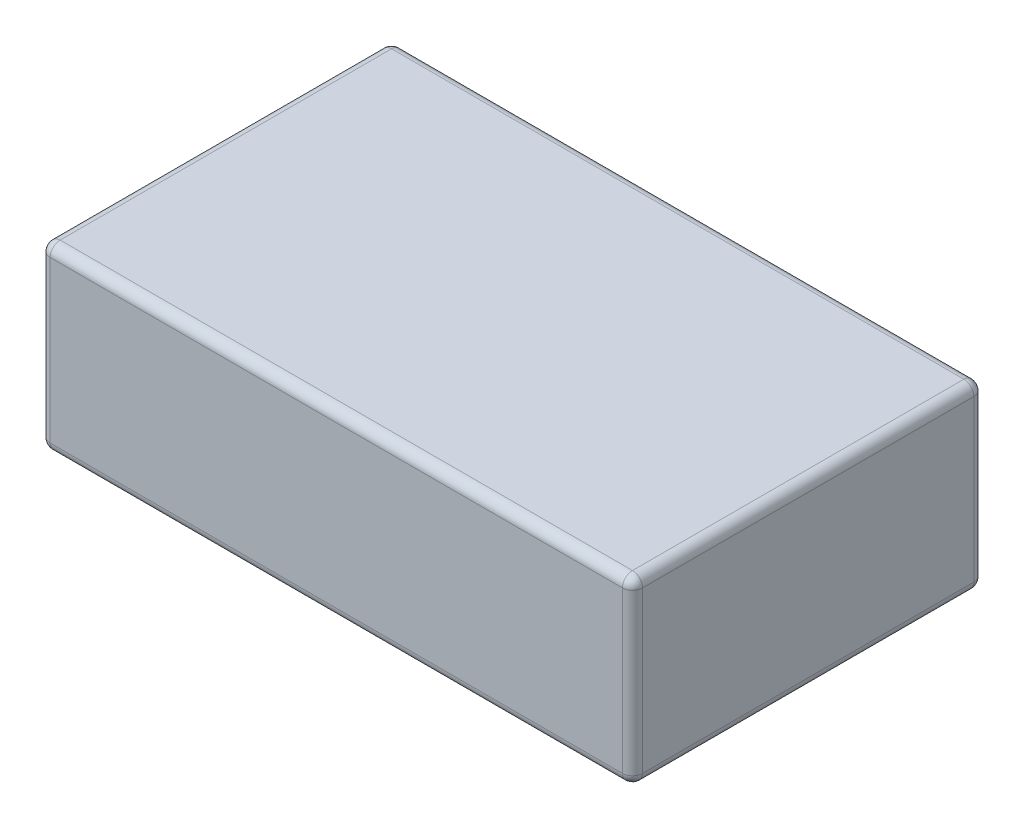
ISO-10303-21;
HEADER;
FILE_DESCRIPTION(('STEP AP214'),'2;1');
FILE_NAME('part.step','',(''),(''),'','','');
FILE_SCHEMA(('AUTOMOTIVE_DESIGN { 1 0 10303 214 1 1 1 1 }'));
ENDSEC;
DATA;
#1=APPLICATION_CONTEXT('core data for automotive mechanical design processes');
#2=APPLICATION_PROTOCOL_DEFINITION('international standard','automotive_design',2000,#1);
#3=PRODUCT_CONTEXT('',#1,'mechanical');
#4=PRODUCT('Part','Part','',(#3));
#5=PRODUCT_RELATED_PRODUCT_CATEGORY('part','',(#4));
#6=PRODUCT_DEFINITION_FORMATION('','',#4);
#7=PRODUCT_DEFINITION_CONTEXT('part definition',#1,'design');
#8=PRODUCT_DEFINITION('design','',#6,#7);
#9=PRODUCT_DEFINITION_SHAPE('','',#8);
#10=(LENGTH_UNIT() NAMED_UNIT(*) SI_UNIT(.MILLI.,.METRE.));
#11=(NAMED_UNIT(*) PLANE_ANGLE_UNIT() SI_UNIT($,.RADIAN.));
#12=(NAMED_UNIT(*) SI_UNIT($,.STERADIAN.) SOLID_ANGLE_UNIT());
#13=UNCERTAINTY_MEASURE_WITH_UNIT(LENGTH_MEASURE(1.E-05),#10,'distance_accuracy_value','');
#14=(GEOMETRIC_REPRESENTATION_CONTEXT(3) GLOBAL_UNCERTAINTY_ASSIGNED_CONTEXT((#13)) GLOBAL_UNIT_ASSIGNED_CONTEXT((#10,
#11,#12)) REPRESENTATION_CONTEXT('',''));
#15=CARTESIAN_POINT('',(0.,0.,0.));
#16=DIRECTION('',(0.,0.,1.));
#17=DIRECTION('',(1.,0.,0.));
#18=AXIS2_PLACEMENT_3D('',#15,#16,#17);
#19=CARTESIAN_POINT('',(59.,36.,-35.));
#20=DIRECTION('',(-1.,0.,0.));
#21=DIRECTION('',(0.,0.,1.));
#22=AXIS2_PLACEMENT_3D('',#19,#20,#21);
#23=PLANE('',#22);
#24=DIRECTION('',(0.,0.,-1.));
#25=VECTOR('',#24,1.);
#26=CARTESIAN_POINT('',(59.,2.,-35.));
#27=LINE('',#26,#25);
#28=CARTESIAN_POINT('',(59.,2.,33.));
#29=VERTEX_POINT('',#28);
#30=CARTESIAN_POINT('',(59.,2.,-33.));
#31=VERTEX_POINT('',#30);
#32=EDGE_CURVE('E332',#29,#31,#27,.T.);
#33=ORIENTED_EDGE('',*,*,#32,.T.);
#34=DIRECTION('',(0.,-1.,0.));
#35=VECTOR('',#34,1.);
#36=CARTESIAN_POINT('',(59.,36.,-33.));
#37=LINE('',#36,#35);
#38=CARTESIAN_POINT('',(59.,34.,-33.));
#39=VERTEX_POINT('',#38);
#40=EDGE_CURVE('E334',#31,#39,#37,.F.);
#41=ORIENTED_EDGE('',*,*,#40,.T.);
#42=DIRECTION('',(0.,0.,-1.));
#43=VECTOR('',#42,1.);
#44=CARTESIAN_POINT('',(59.,34.,35.));
#45=LINE('',#44,#43);
#46=CARTESIAN_POINT('',(59.,34.,33.));
#47=VERTEX_POINT('',#46);
#48=EDGE_CURVE('E328',#39,#47,#45,.F.);
#49=ORIENTED_EDGE('',*,*,#48,.T.);
#50=DIRECTION('',(0.,-1.,0.));
#51=VECTOR('',#50,1.);
#52=CARTESIAN_POINT('',(59.,36.,33.));
#53=LINE('',#52,#51);
#54=EDGE_CURVE('E330',#47,#29,#53,.T.);
#55=ORIENTED_EDGE('',*,*,#54,.T.);
#56=EDGE_LOOP('',(#33,#41,#49,#55));
#57=FACE_BOUND('',#56,.T.);
#58=ADVANCED_FACE('F37',(#57),#23,.F.);
#59=CARTESIAN_POINT('',(-59.,36.,-35.));
#60=DIRECTION('',(0.,0.,1.));
#61=DIRECTION('',(1.,0.,0.));
#62=AXIS2_PLACEMENT_3D('',#59,#60,#61);
#63=PLANE('',#62);
#64=DIRECTION('',(-1.,0.,0.));
#65=VECTOR('',#64,1.);
#66=CARTESIAN_POINT('',(-59.,2.,-35.));
#67=LINE('',#66,#65);
#68=CARTESIAN_POINT('',(57.,2.,-35.));
#69=VERTEX_POINT('',#68);
#70=CARTESIAN_POINT('',(-57.,2.,-35.));
#71=VERTEX_POINT('',#70);
#72=EDGE_CURVE('E314',#69,#71,#67,.T.);
#73=ORIENTED_EDGE('',*,*,#72,.T.);
#74=DIRECTION('',(0.,-1.,0.));
#75=VECTOR('',#74,1.);
#76=CARTESIAN_POINT('',(-57.,36.,-35.));
#77=LINE('',#76,#75);
#78=CARTESIAN_POINT('',(-57.,34.,-35.));
#79=VERTEX_POINT('',#78);
#80=EDGE_CURVE('E316',#71,#79,#77,.F.);
#81=ORIENTED_EDGE('',*,*,#80,.T.);
#82=DIRECTION('',(-1.,0.,0.));
#83=VECTOR('',#82,1.);
#84=CARTESIAN_POINT('',(59.,34.,-35.));
#85=LINE('',#84,#83);
#86=CARTESIAN_POINT('',(57.,34.,-35.));
#87=VERTEX_POINT('',#86);
#88=EDGE_CURVE('E310',#79,#87,#85,.F.);
#89=ORIENTED_EDGE('',*,*,#88,.T.);
#90=DIRECTION('',(0.,-1.,0.));
#91=VECTOR('',#90,1.);
#92=CARTESIAN_POINT('',(57.,36.,-35.));
#93=LINE('',#92,#91);
#94=EDGE_CURVE('E312',#87,#69,#93,.T.);
#95=ORIENTED_EDGE('',*,*,#94,.T.);
#96=EDGE_LOOP('',(#73,#81,#89,#95));
#97=FACE_BOUND('',#96,.T.);
#98=ADVANCED_FACE('F517',(#97),#63,.F.);
#99=CARTESIAN_POINT('',(-59.,36.,-35.));
#100=DIRECTION('',(1.,0.,0.));
#101=DIRECTION('',(0.,0.,-1.));
#102=AXIS2_PLACEMENT_3D('',#99,#100,#101);
#103=PLANE('',#102);
#104=DIRECTION('',(0.,0.,1.));
#105=VECTOR('',#104,1.);
#106=CARTESIAN_POINT('',(-59.,14.,-30.));
#107=LINE('',#106,#105);
#108=CARTESIAN_POINT('',(-59.,14.,-30.));
#109=VERTEX_POINT('',#108);
#110=CARTESIAN_POINT('',(-59.,14.,-15.));
#111=VERTEX_POINT('',#110);
#112=EDGE_CURVE('E229',#109,#111,#107,.T.);
#113=ORIENTED_EDGE('',*,*,#112,.F.);
#114=DIRECTION('',(0.,-1.,0.));
#115=VECTOR('',#114,1.);
#116=CARTESIAN_POINT('',(-59.,22.,-30.));
#117=LINE('',#116,#115);
#118=CARTESIAN_POINT('',(-59.,22.,-30.));
#119=VERTEX_POINT('',#118);
#120=EDGE_CURVE('E54',#119,#109,#117,.T.);
#121=ORIENTED_EDGE('',*,*,#120,.F.);
#122=DIRECTION('',(0.,0.,-1.));
#123=VECTOR('',#122,1.);
#124=CARTESIAN_POINT('',(-59.,22.,-30.));
#125=LINE('',#124,#123);
#126=CARTESIAN_POINT('',(-59.,22.,-15.));
#127=VERTEX_POINT('',#126);
#128=EDGE_CURVE('E220',#127,#119,#125,.T.);
#129=ORIENTED_EDGE('',*,*,#128,.F.);
#130=DIRECTION('',(0.,1.,0.));
#131=VECTOR('',#130,1.);
#132=CARTESIAN_POINT('',(-59.,22.,-15.));
#133=LINE('',#132,#131);
#134=EDGE_CURVE('E223',#111,#127,#133,.T.);
#135=ORIENTED_EDGE('',*,*,#134,.F.);
#136=EDGE_LOOP('',(#113,#121,#129,#135));
#137=FACE_BOUND('',#136,.T.);
#138=DIRECTION('',(0.,0.,1.));
#139=VECTOR('',#138,1.);
#140=CARTESIAN_POINT('',(-59.,14.,16.));
#141=LINE('',#140,#139);
#142=CARTESIAN_POINT('',(-59.,14.,16.));
#143=VERTEX_POINT('',#142);
#144=CARTESIAN_POINT('',(-59.,14.,31.));
#145=VERTEX_POINT('',#144);
#146=EDGE_CURVE('E256',#143,#145,#141,.T.);
#147=ORIENTED_EDGE('',*,*,#146,.F.);
#148=DIRECTION('',(0.,-1.,0.));
#149=VECTOR('',#148,1.);
#150=CARTESIAN_POINT('',(-59.,22.,16.));
#151=LINE('',#150,#149);
#152=CARTESIAN_POINT('',(-59.,22.,16.));
#153=VERTEX_POINT('',#152);
#154=EDGE_CURVE('E62',#153,#143,#151,.T.);
#155=ORIENTED_EDGE('',*,*,#154,.F.);
#156=DIRECTION('',(0.,0.,-1.));
#157=VECTOR('',#156,1.);
#158=CARTESIAN_POINT('',(-59.,22.,16.));
#159=LINE('',#158,#157);
#160=CARTESIAN_POINT('',(-59.,22.,31.));
#161=VERTEX_POINT('',#160);
#162=EDGE_CURVE('E249',#161,#153,#159,.T.);
#163=ORIENTED_EDGE('',*,*,#162,.F.);
#164=DIRECTION('',(0.,1.,0.));
#165=VECTOR('',#164,1.);
#166=CARTESIAN_POINT('',(-59.,22.,31.));
#167=LINE('',#166,#165);
#168=EDGE_CURVE('E252',#145,#161,#167,.T.);
#169=ORIENTED_EDGE('',*,*,#168,.F.);
#170=EDGE_LOOP('',(#147,#155,#163,#169));
#171=FACE_BOUND('',#170,.T.);
#172=DIRECTION('',(0.,0.,1.));
#173=VECTOR('',#172,1.);
#174=CARTESIAN_POINT('',(-59.,15.5,-2.99999999999999));
#175=LINE('',#174,#173);
#176=CARTESIAN_POINT('',(-59.,15.5,-3.));
#177=VERTEX_POINT('',#176);
#178=CARTESIAN_POINT('',(-59.,15.5,2.));
#179=VERTEX_POINT('',#178);
#180=EDGE_CURVE('E287',#177,#179,#175,.T.);
#181=ORIENTED_EDGE('',*,*,#180,.F.);
#182=CARTESIAN_POINT('',(-59.,18.,-3.));
#183=DIRECTION('',(-1.,0.,0.));
#184=DIRECTION('',(0.,0.,1.));
#185=AXIS2_PLACEMENT_3D('',#182,#183,#184);
#186=CIRCLE('',#185,2.5);
#187=CARTESIAN_POINT('',(-59.,20.5,-3.));
#188=VERTEX_POINT('',#187);
#189=EDGE_CURVE('E248',#188,#177,#186,.T.);
#190=ORIENTED_EDGE('',*,*,#189,.F.);
#191=DIRECTION('',(0.,0.,-1.));
#192=VECTOR('',#191,1.);
#193=CARTESIAN_POINT('',(-59.,20.5,-3.));
#194=LINE('',#193,#192);
#195=CARTESIAN_POINT('',(-59.,20.5,2.));
#196=VERTEX_POINT('',#195);
#197=EDGE_CURVE('E280',#196,#188,#194,.T.);
#198=ORIENTED_EDGE('',*,*,#197,.F.);
#199=CARTESIAN_POINT('',(-59.,18.,2.));
#200=DIRECTION('',(-1.,0.,0.));
#201=DIRECTION('',(0.,0.,1.));
#202=AXIS2_PLACEMENT_3D('',#199,#200,#201);
#203=CIRCLE('',#202,2.5);
#204=EDGE_CURVE('E283',#179,#196,#203,.T.);
#205=ORIENTED_EDGE('',*,*,#204,.F.);
#206=EDGE_LOOP('',(#181,#190,#198,#205));
#207=FACE_BOUND('',#206,.T.);
#208=DIRECTION('',(0.,0.,1.));
#209=VECTOR('',#208,1.);
#210=CARTESIAN_POINT('',(-59.,34.,-35.));
#211=LINE('',#210,#209);
#212=CARTESIAN_POINT('',(-59.,34.,33.));
#213=VERTEX_POINT('',#212);
#214=CARTESIAN_POINT('',(-59.,34.,-33.));
#215=VERTEX_POINT('',#214);
#216=EDGE_CURVE('E301',#213,#215,#211,.F.);
#217=ORIENTED_EDGE('',*,*,#216,.T.);
#218=DIRECTION('',(0.,-1.,0.));
#219=VECTOR('',#218,1.);
#220=CARTESIAN_POINT('',(-59.,36.,-33.));
#221=LINE('',#220,#219);
#222=CARTESIAN_POINT('',(-59.,2.,-33.));
#223=VERTEX_POINT('',#222);
#224=EDGE_CURVE('E307',#215,#223,#221,.T.);
#225=ORIENTED_EDGE('',*,*,#224,.T.);
#226=DIRECTION('',(0.,0.,1.));
#227=VECTOR('',#226,1.);
#228=CARTESIAN_POINT('',(-59.,2.,-35.));
#229=LINE('',#228,#227);
#230=CARTESIAN_POINT('',(-59.,2.,33.));
#231=VERTEX_POINT('',#230);
#232=EDGE_CURVE('E305',#223,#231,#229,.T.);
#233=ORIENTED_EDGE('',*,*,#232,.T.);
#234=DIRECTION('',(0.,-1.,0.));
#235=VECTOR('',#234,1.);
#236=CARTESIAN_POINT('',(-59.,36.,33.));
#237=LINE('',#236,#235);
#238=EDGE_CURVE('E303',#231,#213,#237,.F.);
#239=ORIENTED_EDGE('',*,*,#238,.T.);
#240=EDGE_LOOP('',(#217,#225,#233,#239));
#241=FACE_BOUND('',#240,.T.);
#242=ADVANCED_FACE('F450',(#137,#171,#207,#241),#103,.F.);
#243=CARTESIAN_POINT('',(-59.,36.,35.));
#244=DIRECTION('',(0.,0.,-1.));
#245=DIRECTION('',(-1.,0.,0.));
#246=AXIS2_PLACEMENT_3D('',#243,#244,#245);
#247=PLANE('',#246);
#248=DIRECTION('',(0.,-1.,0.));
#249=VECTOR('',#248,1.);
#250=CARTESIAN_POINT('',(-57.,36.,35.));
#251=LINE('',#250,#249);
#252=CARTESIAN_POINT('',(-57.,34.,35.));
#253=VERTEX_POINT('',#252);
#254=CARTESIAN_POINT('',(-57.,2.,35.));
#255=VERTEX_POINT('',#254);
#256=EDGE_CURVE('E341',#253,#255,#251,.T.);
#257=ORIENTED_EDGE('',*,*,#256,.T.);
#258=DIRECTION('',(1.,0.,0.));
#259=VECTOR('',#258,1.);
#260=CARTESIAN_POINT('',(-59.,2.,35.));
#261=LINE('',#260,#259);
#262=CARTESIAN_POINT('',(57.,2.,35.));
#263=VERTEX_POINT('',#262);
#264=EDGE_CURVE('E344',#255,#263,#261,.T.);
#265=ORIENTED_EDGE('',*,*,#264,.T.);
#266=DIRECTION('',(0.,-1.,0.));
#267=VECTOR('',#266,1.);
#268=CARTESIAN_POINT('',(57.,36.,35.));
#269=LINE('',#268,#267);
#270=CARTESIAN_POINT('',(57.,34.,35.));
#271=VERTEX_POINT('',#270);
#272=EDGE_CURVE('E339',#263,#271,#269,.F.);
#273=ORIENTED_EDGE('',*,*,#272,.T.);
#274=DIRECTION('',(1.,0.,0.));
#275=VECTOR('',#274,1.);
#276=CARTESIAN_POINT('',(-59.,34.,35.));
#277=LINE('',#276,#275);
#278=EDGE_CURVE('E337',#271,#253,#277,.F.);
#279=ORIENTED_EDGE('',*,*,#278,.T.);
#280=EDGE_LOOP('',(#257,#265,#273,#279));
#281=FACE_BOUND('',#280,.T.);
#282=ADVANCED_FACE('F460',(#281),#247,.F.);
#283=CARTESIAN_POINT('',(0.,36.,0.));
#284=DIRECTION('',(0.,1.,0.));
#285=DIRECTION('',(0.,0.,1.));
#286=AXIS2_PLACEMENT_3D('',#283,#284,#285);
#287=PLANE('',#286);
#288=DIRECTION('',(0.,0.,1.));
#289=VECTOR('',#288,1.);
#290=CARTESIAN_POINT('',(-57.,36.,35.));
#291=LINE('',#290,#289);
#292=CARTESIAN_POINT('',(-57.,36.,-33.));
#293=VERTEX_POINT('',#292);
#294=CARTESIAN_POINT('',(-57.,36.,33.));
#295=VERTEX_POINT('',#294);
#296=EDGE_CURVE('E46',#293,#295,#291,.T.);
#297=ORIENTED_EDGE('',*,*,#296,.T.);
#298=DIRECTION('',(1.,0.,0.));
#299=VECTOR('',#298,1.);
#300=CARTESIAN_POINT('',(59.,36.,33.));
#301=LINE('',#300,#299);
#302=CARTESIAN_POINT('',(57.,36.,33.));
#303=VERTEX_POINT('',#302);
#304=EDGE_CURVE('E11',#295,#303,#301,.T.);
#305=ORIENTED_EDGE('',*,*,#304,.T.);
#306=DIRECTION('',(0.,0.,-1.));
#307=VECTOR('',#306,1.);
#308=CARTESIAN_POINT('',(57.,36.,-35.));
#309=LINE('',#308,#307);
#310=CARTESIAN_POINT('',(57.,36.,-33.));
#311=VERTEX_POINT('',#310);
#312=EDGE_CURVE('E346',#303,#311,#309,.T.);
#313=ORIENTED_EDGE('',*,*,#312,.T.);
#314=DIRECTION('',(-1.,0.,0.));
#315=VECTOR('',#314,1.);
#316=CARTESIAN_POINT('',(-59.,36.,-33.));
#317=LINE('',#316,#315);
#318=EDGE_CURVE('E348',#311,#293,#317,.T.);
#319=ORIENTED_EDGE('',*,*,#318,.T.);
#320=EDGE_LOOP('',(#297,#305,#313,#319));
#321=FACE_BOUND('',#320,.T.);
#322=ADVANCED_FACE('F432',(#321),#287,.T.);
#323=CARTESIAN_POINT('',(0.,0.,0.));
#324=DIRECTION('',(0.,1.,0.));
#325=DIRECTION('',(0.,0.,1.));
#326=AXIS2_PLACEMENT_3D('',#323,#324,#325);
#327=PLANE('',#326);
#328=DIRECTION('',(0.,0.,1.));
#329=VECTOR('',#328,1.);
#330=CARTESIAN_POINT('',(-57.,0.,0.));
#331=LINE('',#330,#329);
#332=CARTESIAN_POINT('',(-57.,0.,33.));
#333=VERTEX_POINT('',#332);
#334=CARTESIAN_POINT('',(-57.,0.,-33.));
#335=VERTEX_POINT('',#334);
#336=EDGE_CURVE('E323',#333,#335,#331,.F.);
#337=ORIENTED_EDGE('',*,*,#336,.T.);
#338=DIRECTION('',(-1.,0.,0.));
#339=VECTOR('',#338,1.);
#340=CARTESIAN_POINT('',(0.,0.,-33.));
#341=LINE('',#340,#339);
#342=CARTESIAN_POINT('',(57.,0.,-33.));
#343=VERTEX_POINT('',#342);
#344=EDGE_CURVE('E325',#335,#343,#341,.F.);
#345=ORIENTED_EDGE('',*,*,#344,.T.);
#346=DIRECTION('',(0.,0.,-1.));
#347=VECTOR('',#346,1.);
#348=CARTESIAN_POINT('',(57.,0.,0.));
#349=LINE('',#348,#347);
#350=CARTESIAN_POINT('',(57.,0.,33.));
#351=VERTEX_POINT('',#350);
#352=EDGE_CURVE('E321',#343,#351,#349,.F.);
#353=ORIENTED_EDGE('',*,*,#352,.T.);
#354=DIRECTION('',(1.,0.,0.));
#355=VECTOR('',#354,1.);
#356=CARTESIAN_POINT('',(0.,0.,33.));
#357=LINE('',#356,#355);
#358=EDGE_CURVE('E319',#351,#333,#357,.F.);
#359=ORIENTED_EDGE('',*,*,#358,.T.);
#360=EDGE_LOOP('',(#337,#345,#353,#359));
#361=FACE_BOUND('',#360,.T.);
#362=ADVANCED_FACE('F501',(#361),#327,.F.);
#363=CARTESIAN_POINT('',(57.,36.,33.));
#364=DIRECTION('',(0.,-1.,0.));
#365=DIRECTION('',(0.,0.,-1.));
#366=AXIS2_PLACEMENT_3D('',#363,#364,#365);
#367=CYLINDRICAL_SURFACE('',#366,2.);
#368=CARTESIAN_POINT('',(57.,34.,33.));
#369=DIRECTION('',(0.,1.,0.));
#370=DIRECTION('',(0.,0.,1.));
#371=AXIS2_PLACEMENT_3D('',#368,#369,#370);
#372=CIRCLE('',#371,2.);
#373=EDGE_CURVE('E41',#271,#47,#372,.T.);
#374=ORIENTED_EDGE('',*,*,#373,.F.);
#375=ORIENTED_EDGE('',*,*,#272,.F.);
#376=CARTESIAN_POINT('',(57.,2.,33.));
#377=DIRECTION('',(0.,-1.,0.));
#378=DIRECTION('',(0.,0.,-1.));
#379=AXIS2_PLACEMENT_3D('',#376,#377,#378);
#380=CIRCLE('',#379,2.);
#381=EDGE_CURVE('E410',#29,#263,#380,.T.);
#382=ORIENTED_EDGE('',*,*,#381,.F.);
#383=ORIENTED_EDGE('',*,*,#54,.F.);
#384=EDGE_LOOP('',(#374,#375,#382,#383));
#385=FACE_BOUND('',#384,.T.);
#386=ADVANCED_FACE('F39',(#385),#367,.T.);
#387=CARTESIAN_POINT('',(57.,34.,33.));
#388=DIRECTION('',(1.,0.,0.));
#389=DIRECTION('',(0.,0.,-1.));
#390=AXIS2_PLACEMENT_3D('',#387,#388,#389);
#391=SPHERICAL_SURFACE('',#390,2.);
#392=CARTESIAN_POINT('',(57.,34.,33.));
#393=DIRECTION('',(1.,0.,0.));
#394=DIRECTION('',(0.,0.,-1.));
#395=AXIS2_PLACEMENT_3D('',#392,#393,#394);
#396=CIRCLE('',#395,2.);
#397=EDGE_CURVE('E405',#271,#303,#396,.F.);
#398=ORIENTED_EDGE('',*,*,#397,.F.);
#399=ORIENTED_EDGE('',*,*,#373,.T.);
#400=CARTESIAN_POINT('',(57.,34.,33.));
#401=DIRECTION('',(0.,0.,1.));
#402=DIRECTION('',(1.,0.,0.));
#403=AXIS2_PLACEMENT_3D('',#400,#401,#402);
#404=CIRCLE('',#403,2.);
#405=EDGE_CURVE('E408',#303,#47,#404,.F.);
#406=ORIENTED_EDGE('',*,*,#405,.F.);
#407=EDGE_LOOP('',(#398,#399,#406));
#408=FACE_BOUND('',#407,.T.);
#409=ADVANCED_FACE('F421',(#408),#391,.T.);
#410=CARTESIAN_POINT('',(57.,2.,33.));
#411=DIRECTION('',(0.,0.,1.));
#412=DIRECTION('',(0.,-1.,0.));
#413=AXIS2_PLACEMENT_3D('',#410,#411,#412);
#414=SPHERICAL_SURFACE('',#413,2.);
#415=CARTESIAN_POINT('',(57.,2.,33.));
#416=DIRECTION('',(0.,0.,1.));
#417=DIRECTION('',(1.,0.,0.));
#418=AXIS2_PLACEMENT_3D('',#415,#416,#417);
#419=CIRCLE('',#418,2.);
#420=EDGE_CURVE('E399',#29,#351,#419,.F.);
#421=ORIENTED_EDGE('',*,*,#420,.F.);
#422=ORIENTED_EDGE('',*,*,#381,.T.);
#423=CARTESIAN_POINT('',(57.,2.,33.));
#424=DIRECTION('',(1.,0.,0.));
#425=DIRECTION('',(0.,0.,-1.));
#426=AXIS2_PLACEMENT_3D('',#423,#424,#425);
#427=CIRCLE('',#426,2.);
#428=EDGE_CURVE('E402',#351,#263,#427,.F.);
#429=ORIENTED_EDGE('',*,*,#428,.F.);
#430=EDGE_LOOP('',(#421,#422,#429));
#431=FACE_BOUND('',#430,.T.);
#432=ADVANCED_FACE('F462',(#431),#414,.T.);
#433=CARTESIAN_POINT('',(57.,34.,0.));
#434=DIRECTION('',(0.,0.,1.));
#435=DIRECTION('',(1.,0.,0.));
#436=AXIS2_PLACEMENT_3D('',#433,#434,#435);
#437=CYLINDRICAL_SURFACE('',#436,2.);
#438=ORIENTED_EDGE('',*,*,#405,.T.);
#439=ORIENTED_EDGE('',*,*,#48,.F.);
#440=CARTESIAN_POINT('',(57.,34.,-33.));
#441=DIRECTION('',(0.,0.,-1.));
#442=DIRECTION('',(-1.,0.,0.));
#443=AXIS2_PLACEMENT_3D('',#440,#441,#442);
#444=CIRCLE('',#443,2.);
#445=EDGE_CURVE('E394',#311,#39,#444,.T.);
#446=ORIENTED_EDGE('',*,*,#445,.F.);
#447=ORIENTED_EDGE('',*,*,#312,.F.);
#448=EDGE_LOOP('',(#438,#439,#446,#447));
#449=FACE_BOUND('',#448,.T.);
#450=ADVANCED_FACE('F428',(#449),#437,.T.);
#451=CARTESIAN_POINT('',(0.,34.,33.));
#452=DIRECTION('',(-1.,0.,0.));
#453=DIRECTION('',(0.,0.,1.));
#454=AXIS2_PLACEMENT_3D('',#451,#452,#453);
#455=CYLINDRICAL_SURFACE('',#454,2.);
#456=ORIENTED_EDGE('',*,*,#397,.T.);
#457=ORIENTED_EDGE('',*,*,#304,.F.);
#458=CARTESIAN_POINT('',(-57.,34.,33.));
#459=DIRECTION('',(-1.,0.,0.));
#460=DIRECTION('',(0.,0.,1.));
#461=AXIS2_PLACEMENT_3D('',#458,#459,#460);
#462=CIRCLE('',#461,2.);
#463=EDGE_CURVE('E391',#253,#295,#462,.T.);
#464=ORIENTED_EDGE('',*,*,#463,.F.);
#465=ORIENTED_EDGE('',*,*,#278,.F.);
#466=EDGE_LOOP('',(#456,#457,#464,#465));
#467=FACE_BOUND('',#466,.T.);
#468=ADVANCED_FACE('F438',(#467),#455,.T.);
#469=CARTESIAN_POINT('',(-57.,36.,33.));
#470=DIRECTION('',(0.,-1.,0.));
#471=DIRECTION('',(0.,0.,-1.));
#472=AXIS2_PLACEMENT_3D('',#469,#470,#471);
#473=CYLINDRICAL_SURFACE('',#472,2.);
#474=CARTESIAN_POINT('',(-57.,2.,33.));
#475=DIRECTION('',(0.,-1.,0.));
#476=DIRECTION('',(0.,0.,-1.));
#477=AXIS2_PLACEMENT_3D('',#474,#475,#476);
#478=CIRCLE('',#477,2.);
#479=EDGE_CURVE('E385',#255,#231,#478,.T.);
#480=ORIENTED_EDGE('',*,*,#479,.F.);
#481=ORIENTED_EDGE('',*,*,#256,.F.);
#482=CARTESIAN_POINT('',(-57.,34.,33.));
#483=DIRECTION('',(0.,1.,0.));
#484=DIRECTION('',(0.,0.,1.));
#485=AXIS2_PLACEMENT_3D('',#482,#483,#484);
#486=CIRCLE('',#485,2.);
#487=EDGE_CURVE('E388',#213,#253,#486,.T.);
#488=ORIENTED_EDGE('',*,*,#487,.F.);
#489=ORIENTED_EDGE('',*,*,#238,.F.);
#490=EDGE_LOOP('',(#480,#481,#488,#489));
#491=FACE_BOUND('',#490,.T.);
#492=ADVANCED_FACE('F457',(#491),#473,.T.);
#493=CARTESIAN_POINT('',(-59.,2.,33.));
#494=DIRECTION('',(1.,0.,0.));
#495=DIRECTION('',(0.,0.,-1.));
#496=AXIS2_PLACEMENT_3D('',#493,#494,#495);
#497=CYLINDRICAL_SURFACE('',#496,2.);
#498=ORIENTED_EDGE('',*,*,#428,.T.);
#499=ORIENTED_EDGE('',*,*,#264,.F.);
#500=CARTESIAN_POINT('',(-57.,2.,33.));
#501=DIRECTION('',(-1.,0.,0.));
#502=DIRECTION('',(0.,0.,1.));
#503=AXIS2_PLACEMENT_3D('',#500,#501,#502);
#504=CIRCLE('',#503,2.);
#505=EDGE_CURVE('E383',#333,#255,#504,.T.);
#506=ORIENTED_EDGE('',*,*,#505,.F.);
#507=ORIENTED_EDGE('',*,*,#358,.F.);
#508=EDGE_LOOP('',(#498,#499,#506,#507));
#509=FACE_BOUND('',#508,.T.);
#510=ADVANCED_FACE('F499',(#509),#497,.T.);
#511=CARTESIAN_POINT('',(57.,2.,-35.));
#512=DIRECTION('',(0.,0.,-1.));
#513=DIRECTION('',(-1.,0.,0.));
#514=AXIS2_PLACEMENT_3D('',#511,#512,#513);
#515=CYLINDRICAL_SURFACE('',#514,2.);
#516=ORIENTED_EDGE('',*,*,#420,.T.);
#517=ORIENTED_EDGE('',*,*,#352,.F.);
#518=CARTESIAN_POINT('',(57.,2.,-33.));
#519=DIRECTION('',(0.,0.,-1.));
#520=DIRECTION('',(-1.,0.,0.));
#521=AXIS2_PLACEMENT_3D('',#518,#519,#520);
#522=CIRCLE('',#521,2.);
#523=EDGE_CURVE('E380',#31,#343,#522,.T.);
#524=ORIENTED_EDGE('',*,*,#523,.F.);
#525=ORIENTED_EDGE('',*,*,#32,.F.);
#526=EDGE_LOOP('',(#516,#517,#524,#525));
#527=FACE_BOUND('',#526,.T.);
#528=ADVANCED_FACE('F467',(#527),#515,.T.);
#529=CARTESIAN_POINT('',(57.,36.,-33.));
#530=DIRECTION('',(0.,-1.,0.));
#531=DIRECTION('',(0.,0.,-1.));
#532=AXIS2_PLACEMENT_3D('',#529,#530,#531);
#533=CYLINDRICAL_SURFACE('',#532,2.);
#534=CARTESIAN_POINT('',(57.,34.,-33.));
#535=DIRECTION('',(0.,1.,0.));
#536=DIRECTION('',(0.,0.,1.));
#537=AXIS2_PLACEMENT_3D('',#534,#535,#536);
#538=CIRCLE('',#537,2.);
#539=EDGE_CURVE('E396',#39,#87,#538,.T.);
#540=ORIENTED_EDGE('',*,*,#539,.F.);
#541=ORIENTED_EDGE('',*,*,#40,.F.);
#542=CARTESIAN_POINT('',(57.,2.,-33.));
#543=DIRECTION('',(0.,-1.,0.));
#544=DIRECTION('',(0.,0.,-1.));
#545=AXIS2_PLACEMENT_3D('',#542,#543,#544);
#546=CIRCLE('',#545,2.);
#547=EDGE_CURVE('E377',#69,#31,#546,.T.);
#548=ORIENTED_EDGE('',*,*,#547,.F.);
#549=ORIENTED_EDGE('',*,*,#94,.F.);
#550=EDGE_LOOP('',(#540,#541,#548,#549));
#551=FACE_BOUND('',#550,.T.);
#552=ADVANCED_FACE('F473',(#551),#533,.T.);
#553=CARTESIAN_POINT('',(57.,34.,-33.));
#554=DIRECTION('',(1.,0.,0.));
#555=DIRECTION('',(0.,0.,-1.));
#556=AXIS2_PLACEMENT_3D('',#553,#554,#555);
#557=SPHERICAL_SURFACE('',#556,2.);
#558=ORIENTED_EDGE('',*,*,#445,.T.);
#559=ORIENTED_EDGE('',*,*,#539,.T.);
#560=CARTESIAN_POINT('',(57.,34.,-33.));
#561=DIRECTION('',(1.,0.,0.));
#562=DIRECTION('',(0.,0.,-1.));
#563=AXIS2_PLACEMENT_3D('',#560,#561,#562);
#564=CIRCLE('',#563,2.);
#565=EDGE_CURVE('E374',#311,#87,#564,.F.);
#566=ORIENTED_EDGE('',*,*,#565,.F.);
#567=EDGE_LOOP('',(#558,#559,#566));
#568=FACE_BOUND('',#567,.T.);
#569=ADVANCED_FACE('F477',(#568),#557,.T.);
#570=CARTESIAN_POINT('',(-57.,34.,33.));
#571=DIRECTION('',(0.,0.,1.));
#572=DIRECTION('',(1.,0.,0.));
#573=AXIS2_PLACEMENT_3D('',#570,#571,#572);
#574=SPHERICAL_SURFACE('',#573,2.);
#575=ORIENTED_EDGE('',*,*,#487,.T.);
#576=ORIENTED_EDGE('',*,*,#463,.T.);
#577=CARTESIAN_POINT('',(-57.,34.,33.));
#578=DIRECTION('',(0.,0.,1.));
#579=DIRECTION('',(1.,0.,0.));
#580=AXIS2_PLACEMENT_3D('',#577,#578,#579);
#581=CIRCLE('',#580,2.);
#582=EDGE_CURVE('E371',#213,#295,#581,.F.);
#583=ORIENTED_EDGE('',*,*,#582,.F.);
#584=EDGE_LOOP('',(#575,#576,#583));
#585=FACE_BOUND('',#584,.T.);
#586=ADVANCED_FACE('F441',(#585),#574,.T.);
#587=CARTESIAN_POINT('',(-57.,2.,33.));
#588=DIRECTION('',(0.,0.,1.));
#589=DIRECTION('',(0.,-1.,0.));
#590=AXIS2_PLACEMENT_3D('',#587,#588,#589);
#591=SPHERICAL_SURFACE('',#590,2.);
#592=ORIENTED_EDGE('',*,*,#505,.T.);
#593=ORIENTED_EDGE('',*,*,#479,.T.);
#594=CARTESIAN_POINT('',(-57.,2.,33.));
#595=DIRECTION('',(0.,0.,1.));
#596=DIRECTION('',(1.,0.,0.));
#597=AXIS2_PLACEMENT_3D('',#594,#595,#596);
#598=CIRCLE('',#597,2.);
#599=EDGE_CURVE('E368',#333,#231,#598,.F.);
#600=ORIENTED_EDGE('',*,*,#599,.F.);
#601=EDGE_LOOP('',(#592,#593,#600));
#602=FACE_BOUND('',#601,.T.);
#603=ADVANCED_FACE('F496',(#602),#591,.T.);
#604=CARTESIAN_POINT('',(57.,2.,-33.));
#605=DIRECTION('',(1.,0.,0.));
#606=DIRECTION('',(0.,1.,0.));
#607=AXIS2_PLACEMENT_3D('',#604,#605,#606);
#608=SPHERICAL_SURFACE('',#607,2.);
#609=ORIENTED_EDGE('',*,*,#547,.T.);
#610=ORIENTED_EDGE('',*,*,#523,.T.);
#611=CARTESIAN_POINT('',(57.,2.,-33.));
#612=DIRECTION('',(1.,0.,0.));
#613=DIRECTION('',(0.,0.,-1.));
#614=AXIS2_PLACEMENT_3D('',#611,#612,#613);
#615=CIRCLE('',#614,2.);
#616=EDGE_CURVE('E366',#69,#343,#615,.F.);
#617=ORIENTED_EDGE('',*,*,#616,.F.);
#618=EDGE_LOOP('',(#609,#610,#617));
#619=FACE_BOUND('',#618,.T.);
#620=ADVANCED_FACE('F507',(#619),#608,.T.);
#621=CARTESIAN_POINT('',(0.,34.,-33.));
#622=DIRECTION('',(1.,0.,0.));
#623=DIRECTION('',(0.,0.,-1.));
#624=AXIS2_PLACEMENT_3D('',#621,#622,#623);
#625=CYLINDRICAL_SURFACE('',#624,2.);
#626=ORIENTED_EDGE('',*,*,#565,.T.);
#627=ORIENTED_EDGE('',*,*,#88,.F.);
#628=CARTESIAN_POINT('',(-57.,34.,-33.));
#629=DIRECTION('',(-1.,0.,0.));
#630=DIRECTION('',(0.,0.,1.));
#631=AXIS2_PLACEMENT_3D('',#628,#629,#630);
#632=CIRCLE('',#631,2.);
#633=EDGE_CURVE('E363',#293,#79,#632,.T.);
#634=ORIENTED_EDGE('',*,*,#633,.F.);
#635=ORIENTED_EDGE('',*,*,#318,.F.);
#636=EDGE_LOOP('',(#626,#627,#634,#635));
#637=FACE_BOUND('',#636,.T.);
#638=ADVANCED_FACE('F480',(#637),#625,.T.);
#639=CARTESIAN_POINT('',(-57.,34.,0.));
#640=DIRECTION('',(0.,0.,-1.));
#641=DIRECTION('',(-1.,0.,0.));
#642=AXIS2_PLACEMENT_3D('',#639,#640,#641);
#643=CYLINDRICAL_SURFACE('',#642,2.);
#644=ORIENTED_EDGE('',*,*,#582,.T.);
#645=ORIENTED_EDGE('',*,*,#296,.F.);
#646=CARTESIAN_POINT('',(-57.,34.,-33.));
#647=DIRECTION('',(0.,0.,-1.));
#648=DIRECTION('',(-1.,0.,0.));
#649=AXIS2_PLACEMENT_3D('',#646,#647,#648);
#650=CIRCLE('',#649,2.);
#651=EDGE_CURVE('E360',#215,#293,#650,.T.);
#652=ORIENTED_EDGE('',*,*,#651,.F.);
#653=ORIENTED_EDGE('',*,*,#216,.F.);
#654=EDGE_LOOP('',(#644,#645,#652,#653));
#655=FACE_BOUND('',#654,.T.);
#656=ADVANCED_FACE('F445',(#655),#643,.T.);
#657=CARTESIAN_POINT('',(-57.,2.,-35.));
#658=DIRECTION('',(0.,0.,1.));
#659=DIRECTION('',(1.,0.,0.));
#660=AXIS2_PLACEMENT_3D('',#657,#658,#659);
#661=CYLINDRICAL_SURFACE('',#660,2.);
#662=ORIENTED_EDGE('',*,*,#599,.T.);
#663=ORIENTED_EDGE('',*,*,#232,.F.);
#664=CARTESIAN_POINT('',(-57.,2.,-33.));
#665=DIRECTION('',(0.,0.,-1.));
#666=DIRECTION('',(-1.,0.,0.));
#667=AXIS2_PLACEMENT_3D('',#664,#665,#666);
#668=CIRCLE('',#667,2.);
#669=EDGE_CURVE('E357',#335,#223,#668,.T.);
#670=ORIENTED_EDGE('',*,*,#669,.F.);
#671=ORIENTED_EDGE('',*,*,#336,.F.);
#672=EDGE_LOOP('',(#662,#663,#670,#671));
#673=FACE_BOUND('',#672,.T.);
#674=ADVANCED_FACE('F493',(#673),#661,.T.);
#675=CARTESIAN_POINT('',(-59.,2.,-33.));
#676=DIRECTION('',(-1.,0.,0.));
#677=DIRECTION('',(0.,0.,1.));
#678=AXIS2_PLACEMENT_3D('',#675,#676,#677);
#679=CYLINDRICAL_SURFACE('',#678,2.);
#680=ORIENTED_EDGE('',*,*,#616,.T.);
#681=ORIENTED_EDGE('',*,*,#344,.F.);
#682=CARTESIAN_POINT('',(-57.,2.,-33.));
#683=DIRECTION('',(-1.,0.,0.));
#684=DIRECTION('',(0.,0.,1.));
#685=AXIS2_PLACEMENT_3D('',#682,#683,#684);
#686=CIRCLE('',#685,2.);
#687=EDGE_CURVE('E354',#71,#335,#686,.T.);
#688=ORIENTED_EDGE('',*,*,#687,.F.);
#689=ORIENTED_EDGE('',*,*,#72,.F.);
#690=EDGE_LOOP('',(#680,#681,#688,#689));
#691=FACE_BOUND('',#690,.T.);
#692=ADVANCED_FACE('F504',(#691),#679,.T.);
#693=CARTESIAN_POINT('',(-57.,34.,-33.));
#694=DIRECTION('',(0.,1.,0.));
#695=DIRECTION('',(0.,0.,1.));
#696=AXIS2_PLACEMENT_3D('',#693,#694,#695);
#697=SPHERICAL_SURFACE('',#696,2.);
#698=ORIENTED_EDGE('',*,*,#651,.T.);
#699=ORIENTED_EDGE('',*,*,#633,.T.);
#700=CARTESIAN_POINT('',(-57.,34.,-33.));
#701=DIRECTION('',(0.,1.,0.));
#702=DIRECTION('',(0.,0.,1.));
#703=AXIS2_PLACEMENT_3D('',#700,#701,#702);
#704=CIRCLE('',#703,2.);
#705=EDGE_CURVE('E352',#215,#79,#704,.F.);
#706=ORIENTED_EDGE('',*,*,#705,.F.);
#707=EDGE_LOOP('',(#698,#699,#706));
#708=FACE_BOUND('',#707,.T.);
#709=ADVANCED_FACE('F482',(#708),#697,.T.);
#710=CARTESIAN_POINT('',(-57.,2.,-33.));
#711=DIRECTION('',(0.,-1.,0.));
#712=DIRECTION('',(0.,0.,-1.));
#713=AXIS2_PLACEMENT_3D('',#710,#711,#712);
#714=SPHERICAL_SURFACE('',#713,2.);
#715=ORIENTED_EDGE('',*,*,#687,.T.);
#716=ORIENTED_EDGE('',*,*,#669,.T.);
#717=CARTESIAN_POINT('',(-57.,2.,-33.));
#718=DIRECTION('',(0.,-1.,0.));
#719=DIRECTION('',(0.,0.,-1.));
#720=AXIS2_PLACEMENT_3D('',#717,#718,#719);
#721=CIRCLE('',#720,2.);
#722=EDGE_CURVE('E235',#71,#223,#721,.F.);
#723=ORIENTED_EDGE('',*,*,#722,.F.);
#724=EDGE_LOOP('',(#715,#716,#723));
#725=FACE_BOUND('',#724,.T.);
#726=ADVANCED_FACE('F489',(#725),#714,.T.);
#727=CARTESIAN_POINT('',(-57.,36.,-33.));
#728=DIRECTION('',(0.,-1.,0.));
#729=DIRECTION('',(0.,0.,-1.));
#730=AXIS2_PLACEMENT_3D('',#727,#728,#729);
#731=CYLINDRICAL_SURFACE('',#730,2.);
#732=ORIENTED_EDGE('',*,*,#705,.T.);
#733=ORIENTED_EDGE('',*,*,#80,.F.);
#734=ORIENTED_EDGE('',*,*,#722,.T.);
#735=ORIENTED_EDGE('',*,*,#224,.F.);
#736=EDGE_LOOP('',(#732,#733,#734,#735));
#737=FACE_BOUND('',#736,.T.);
#738=ADVANCED_FACE('F485',(#737),#731,.T.);
#739=CARTESIAN_POINT('',(-49.,18.,-3.));
#740=DIRECTION('',(-1.,0.,0.));
#741=DIRECTION('',(0.,0.,1.));
#742=AXIS2_PLACEMENT_3D('',#739,#740,#741);
#743=CYLINDRICAL_SURFACE('',#742,2.5);
#744=ORIENTED_EDGE('',*,*,#189,.T.);
#745=DIRECTION('',(-1.,0.,0.));
#746=VECTOR('',#745,1.);
#747=CARTESIAN_POINT('',(-49.,15.5,-3.));
#748=LINE('',#747,#746);
#749=CARTESIAN_POINT('',(-49.,15.5,-3.));
#750=VERTEX_POINT('',#749);
#751=EDGE_CURVE('E270',#750,#177,#748,.T.);
#752=ORIENTED_EDGE('',*,*,#751,.F.);
#753=CARTESIAN_POINT('',(-49.,18.,-3.));
#754=DIRECTION('',(-1.,0.,0.));
#755=DIRECTION('',(0.,0.,1.));
#756=AXIS2_PLACEMENT_3D('',#753,#754,#755);
#757=CIRCLE('',#756,2.5);
#758=CARTESIAN_POINT('',(-49.,20.5,-3.));
#759=VERTEX_POINT('',#758);
#760=EDGE_CURVE('E284',#759,#750,#757,.T.);
#761=ORIENTED_EDGE('',*,*,#760,.F.);
#762=DIRECTION('',(-1.,0.,0.));
#763=VECTOR('',#762,1.);
#764=CARTESIAN_POINT('',(-49.,20.5,-3.));
#765=LINE('',#764,#763);
#766=EDGE_CURVE('E278',#759,#188,#765,.T.);
#767=ORIENTED_EDGE('',*,*,#766,.T.);
#768=EDGE_LOOP('',(#744,#752,#761,#767));
#769=FACE_BOUND('',#768,.T.);
#770=ADVANCED_FACE('F528',(#769),#743,.F.);
#771=CARTESIAN_POINT('',(-49.,20.5,-3.));
#772=DIRECTION('',(0.,1.,0.));
#773=DIRECTION('',(0.,0.,1.));
#774=AXIS2_PLACEMENT_3D('',#771,#772,#773);
#775=PLANE('',#774);
#776=ORIENTED_EDGE('',*,*,#197,.T.);
#777=ORIENTED_EDGE('',*,*,#766,.F.);
#778=DIRECTION('',(0.,0.,-1.));
#779=VECTOR('',#778,1.);
#780=CARTESIAN_POINT('',(-49.,20.5,-3.));
#781=LINE('',#780,#779);
#782=CARTESIAN_POINT('',(-49.,20.5,2.));
#783=VERTEX_POINT('',#782);
#784=EDGE_CURVE('E273',#783,#759,#781,.T.);
#785=ORIENTED_EDGE('',*,*,#784,.F.);
#786=DIRECTION('',(-1.,0.,0.));
#787=VECTOR('',#786,1.);
#788=CARTESIAN_POINT('',(-49.,20.5,2.));
#789=LINE('',#788,#787);
#790=EDGE_CURVE('E276',#783,#196,#789,.T.);
#791=ORIENTED_EDGE('',*,*,#790,.T.);
#792=EDGE_LOOP('',(#776,#777,#785,#791));
#793=FACE_BOUND('',#792,.T.);
#794=ADVANCED_FACE('F569',(#793),#775,.F.);
#795=CARTESIAN_POINT('',(-49.,18.,2.));
#796=DIRECTION('',(-1.,0.,0.));
#797=DIRECTION('',(0.,0.,1.));
#798=AXIS2_PLACEMENT_3D('',#795,#796,#797);
#799=CYLINDRICAL_SURFACE('',#798,2.5);
#800=ORIENTED_EDGE('',*,*,#204,.T.);
#801=ORIENTED_EDGE('',*,*,#790,.F.);
#802=CARTESIAN_POINT('',(-49.,18.,2.));
#803=DIRECTION('',(-1.,0.,0.));
#804=DIRECTION('',(0.,0.,1.));
#805=AXIS2_PLACEMENT_3D('',#802,#803,#804);
#806=CIRCLE('',#805,2.5);
#807=CARTESIAN_POINT('',(-49.,15.5,2.));
#808=VERTEX_POINT('',#807);
#809=EDGE_CURVE('E293',#808,#783,#806,.T.);
#810=ORIENTED_EDGE('',*,*,#809,.F.);
#811=DIRECTION('',(-1.,0.,0.));
#812=VECTOR('',#811,1.);
#813=CARTESIAN_POINT('',(-49.,15.5,2.));
#814=LINE('',#813,#812);
#815=EDGE_CURVE('E274',#808,#179,#814,.T.);
#816=ORIENTED_EDGE('',*,*,#815,.T.);
#817=EDGE_LOOP('',(#800,#801,#810,#816));
#818=FACE_BOUND('',#817,.T.);
#819=ADVANCED_FACE('F577',(#818),#799,.F.);
#820=CARTESIAN_POINT('',(-49.,15.5,-3.));
#821=DIRECTION('',(0.,-1.,0.));
#822=DIRECTION('',(0.,0.,-1.));
#823=AXIS2_PLACEMENT_3D('',#820,#821,#822);
#824=PLANE('',#823);
#825=ORIENTED_EDGE('',*,*,#180,.T.);
#826=ORIENTED_EDGE('',*,*,#815,.F.);
#827=DIRECTION('',(0.,0.,1.));
#828=VECTOR('',#827,1.);
#829=CARTESIAN_POINT('',(-49.,15.5,-3.));
#830=LINE('',#829,#828);
#831=EDGE_CURVE('E296',#750,#808,#830,.T.);
#832=ORIENTED_EDGE('',*,*,#831,.F.);
#833=ORIENTED_EDGE('',*,*,#751,.T.);
#834=EDGE_LOOP('',(#825,#826,#832,#833));
#835=FACE_BOUND('',#834,.T.);
#836=ADVANCED_FACE('F585',(#835),#824,.F.);
#837=CARTESIAN_POINT('',(-49.,18.,-3.));
#838=DIRECTION('',(-1.,0.,0.));
#839=DIRECTION('',(0.,0.,1.));
#840=AXIS2_PLACEMENT_3D('',#837,#838,#839);
#841=PLANE('',#840);
#842=ORIENTED_EDGE('',*,*,#760,.T.);
#843=ORIENTED_EDGE('',*,*,#831,.T.);
#844=ORIENTED_EDGE('',*,*,#809,.T.);
#845=ORIENTED_EDGE('',*,*,#784,.T.);
#846=EDGE_LOOP('',(#842,#843,#844,#845));
#847=FACE_BOUND('',#846,.T.);
#848=ADVANCED_FACE('F593',(#847),#841,.T.);
#849=CARTESIAN_POINT('',(-49.,22.,16.));
#850=DIRECTION('',(0.,0.,-1.));
#851=DIRECTION('',(-1.,0.,0.));
#852=AXIS2_PLACEMENT_3D('',#849,#850,#851);
#853=PLANE('',#852);
#854=ORIENTED_EDGE('',*,*,#154,.T.);
#855=DIRECTION('',(-1.,0.,0.));
#856=VECTOR('',#855,1.);
#857=CARTESIAN_POINT('',(-49.,14.,16.));
#858=LINE('',#857,#856);
#859=CARTESIAN_POINT('',(-49.,14.,16.));
#860=VERTEX_POINT('',#859);
#861=EDGE_CURVE('E239',#860,#143,#858,.T.);
#862=ORIENTED_EDGE('',*,*,#861,.F.);
#863=DIRECTION('',(0.,-1.,0.));
#864=VECTOR('',#863,1.);
#865=CARTESIAN_POINT('',(-49.,22.,16.));
#866=LINE('',#865,#864);
#867=CARTESIAN_POINT('',(-49.,22.,16.));
#868=VERTEX_POINT('',#867);
#869=EDGE_CURVE('E253',#868,#860,#866,.T.);
#870=ORIENTED_EDGE('',*,*,#869,.F.);
#871=DIRECTION('',(-1.,0.,0.));
#872=VECTOR('',#871,1.);
#873=CARTESIAN_POINT('',(-49.,22.,16.));
#874=LINE('',#873,#872);
#875=EDGE_CURVE('E246',#868,#153,#874,.T.);
#876=ORIENTED_EDGE('',*,*,#875,.T.);
#877=EDGE_LOOP('',(#854,#862,#870,#876));
#878=FACE_BOUND('',#877,.T.);
#879=ADVANCED_FACE('F601',(#878),#853,.F.);
#880=CARTESIAN_POINT('',(-49.,22.,16.));
#881=DIRECTION('',(0.,1.,0.));
#882=DIRECTION('',(0.,0.,1.));
#883=AXIS2_PLACEMENT_3D('',#880,#881,#882);
#884=PLANE('',#883);
#885=ORIENTED_EDGE('',*,*,#162,.T.);
#886=ORIENTED_EDGE('',*,*,#875,.F.);
#887=DIRECTION('',(0.,0.,-1.));
#888=VECTOR('',#887,1.);
#889=CARTESIAN_POINT('',(-49.,22.,16.));
#890=LINE('',#889,#888);
#891=CARTESIAN_POINT('',(-49.,22.,31.));
#892=VERTEX_POINT('',#891);
#893=EDGE_CURVE('E241',#892,#868,#890,.T.);
#894=ORIENTED_EDGE('',*,*,#893,.F.);
#895=DIRECTION('',(-1.,0.,0.));
#896=VECTOR('',#895,1.);
#897=CARTESIAN_POINT('',(-49.,22.,31.));
#898=LINE('',#897,#896);
#899=EDGE_CURVE('E244',#892,#161,#898,.T.);
#900=ORIENTED_EDGE('',*,*,#899,.T.);
#901=EDGE_LOOP('',(#885,#886,#894,#900));
#902=FACE_BOUND('',#901,.T.);
#903=ADVANCED_FACE('F609',(#902),#884,.F.);
#904=CARTESIAN_POINT('',(-49.,22.,31.));
#905=DIRECTION('',(0.,0.,1.));
#906=DIRECTION('',(1.,0.,0.));
#907=AXIS2_PLACEMENT_3D('',#904,#905,#906);
#908=PLANE('',#907);
#909=ORIENTED_EDGE('',*,*,#168,.T.);
#910=ORIENTED_EDGE('',*,*,#899,.F.);
#911=DIRECTION('',(0.,1.,0.));
#912=VECTOR('',#911,1.);
#913=CARTESIAN_POINT('',(-49.,22.,31.));
#914=LINE('',#913,#912);
#915=CARTESIAN_POINT('',(-49.,14.,31.));
#916=VERTEX_POINT('',#915);
#917=EDGE_CURVE('E262',#916,#892,#914,.T.);
#918=ORIENTED_EDGE('',*,*,#917,.F.);
#919=DIRECTION('',(-1.,0.,0.));
#920=VECTOR('',#919,1.);
#921=CARTESIAN_POINT('',(-49.,14.,31.));
#922=LINE('',#921,#920);
#923=EDGE_CURVE('E242',#916,#145,#922,.T.);
#924=ORIENTED_EDGE('',*,*,#923,.T.);
#925=EDGE_LOOP('',(#909,#910,#918,#924));
#926=FACE_BOUND('',#925,.T.);
#927=ADVANCED_FACE('F616',(#926),#908,.F.);
#928=CARTESIAN_POINT('',(-49.,14.,16.));
#929=DIRECTION('',(0.,-1.,0.));
#930=DIRECTION('',(0.,0.,-1.));
#931=AXIS2_PLACEMENT_3D('',#928,#929,#930);
#932=PLANE('',#931);
#933=ORIENTED_EDGE('',*,*,#146,.T.);
#934=ORIENTED_EDGE('',*,*,#923,.F.);
#935=DIRECTION('',(0.,0.,1.));
#936=VECTOR('',#935,1.);
#937=CARTESIAN_POINT('',(-49.,14.,16.));
#938=LINE('',#937,#936);
#939=EDGE_CURVE('E265',#860,#916,#938,.T.);
#940=ORIENTED_EDGE('',*,*,#939,.F.);
#941=ORIENTED_EDGE('',*,*,#861,.T.);
#942=EDGE_LOOP('',(#933,#934,#940,#941));
#943=FACE_BOUND('',#942,.T.);
#944=ADVANCED_FACE('F624',(#943),#932,.F.);
#945=CARTESIAN_POINT('',(-49.,0.,0.));
#946=DIRECTION('',(-1.,0.,0.));
#947=DIRECTION('',(0.,0.,1.));
#948=AXIS2_PLACEMENT_3D('',#945,#946,#947);
#949=PLANE('',#948);
#950=ORIENTED_EDGE('',*,*,#869,.T.);
#951=ORIENTED_EDGE('',*,*,#939,.T.);
#952=ORIENTED_EDGE('',*,*,#917,.T.);
#953=ORIENTED_EDGE('',*,*,#893,.T.);
#954=EDGE_LOOP('',(#950,#951,#952,#953));
#955=FACE_BOUND('',#954,.T.);
#956=ADVANCED_FACE('F632',(#955),#949,.T.);
#957=CARTESIAN_POINT('',(-49.,22.,-30.));
#958=DIRECTION('',(0.,0.,-1.));
#959=DIRECTION('',(-1.,0.,0.));
#960=AXIS2_PLACEMENT_3D('',#957,#958,#959);
#961=PLANE('',#960);
#962=ORIENTED_EDGE('',*,*,#120,.T.);
#963=DIRECTION('',(-1.,0.,0.));
#964=VECTOR('',#963,1.);
#965=CARTESIAN_POINT('',(-49.,14.,-30.));
#966=LINE('',#965,#964);
#967=CARTESIAN_POINT('',(-49.,14.,-30.));
#968=VERTEX_POINT('',#967);
#969=EDGE_CURVE('E198',#968,#109,#966,.T.);
#970=ORIENTED_EDGE('',*,*,#969,.F.);
#971=DIRECTION('',(0.,-1.,0.));
#972=VECTOR('',#971,1.);
#973=CARTESIAN_POINT('',(-49.,22.,-30.));
#974=LINE('',#973,#972);
#975=CARTESIAN_POINT('',(-49.,22.,-30.));
#976=VERTEX_POINT('',#975);
#977=EDGE_CURVE('E202',#976,#968,#974,.T.);
#978=ORIENTED_EDGE('',*,*,#977,.F.);
#979=DIRECTION('',(-1.,0.,0.));
#980=VECTOR('',#979,1.);
#981=CARTESIAN_POINT('',(-49.,22.,-30.));
#982=LINE('',#981,#980);
#983=EDGE_CURVE('E233',#976,#119,#982,.T.);
#984=ORIENTED_EDGE('',*,*,#983,.T.);
#985=EDGE_LOOP('',(#962,#970,#978,#984));
#986=FACE_BOUND('',#985,.T.);
#987=ADVANCED_FACE('F200',(#986),#961,.F.);
#988=CARTESIAN_POINT('',(-49.,22.,-30.));
#989=DIRECTION('',(0.,1.,0.));
#990=DIRECTION('',(0.,0.,1.));
#991=AXIS2_PLACEMENT_3D('',#988,#989,#990);
#992=PLANE('',#991);
#993=ORIENTED_EDGE('',*,*,#128,.T.);
#994=ORIENTED_EDGE('',*,*,#983,.F.);
#995=DIRECTION('',(0.,0.,-1.));
#996=VECTOR('',#995,1.);
#997=CARTESIAN_POINT('',(-49.,22.,-30.));
#998=LINE('',#997,#996);
#999=CARTESIAN_POINT('',(-49.,22.,-15.));
#1000=VERTEX_POINT('',#999);
#1001=EDGE_CURVE('E208',#1000,#976,#998,.T.);
#1002=ORIENTED_EDGE('',*,*,#1001,.F.);
#1003=DIRECTION('',(-1.,0.,0.));
#1004=VECTOR('',#1003,1.);
#1005=CARTESIAN_POINT('',(-49.,22.,-15.));
#1006=LINE('',#1005,#1004);
#1007=EDGE_CURVE('E236',#1000,#127,#1006,.T.);
#1008=ORIENTED_EDGE('',*,*,#1007,.T.);
#1009=EDGE_LOOP('',(#993,#994,#1002,#1008));
#1010=FACE_BOUND('',#1009,.T.);
#1011=ADVANCED_FACE('F647',(#1010),#992,.F.);
#1012=CARTESIAN_POINT('',(-49.,22.,-15.));
#1013=DIRECTION('',(0.,0.,1.));
#1014=DIRECTION('',(1.,0.,0.));
#1015=AXIS2_PLACEMENT_3D('',#1012,#1013,#1014);
#1016=PLANE('',#1015);
#1017=ORIENTED_EDGE('',*,*,#134,.T.);
#1018=ORIENTED_EDGE('',*,*,#1007,.F.);
#1019=DIRECTION('',(0.,1.,0.));
#1020=VECTOR('',#1019,1.);
#1021=CARTESIAN_POINT('',(-49.,22.,-15.));
#1022=LINE('',#1021,#1020);
#1023=CARTESIAN_POINT('',(-49.,14.,-15.));
#1024=VERTEX_POINT('',#1023);
#1025=EDGE_CURVE('E216',#1024,#1000,#1022,.T.);
#1026=ORIENTED_EDGE('',*,*,#1025,.F.);
#1027=DIRECTION('',(-1.,0.,0.));
#1028=VECTOR('',#1027,1.);
#1029=CARTESIAN_POINT('',(-49.,14.,-15.));
#1030=LINE('',#1029,#1028);
#1031=EDGE_CURVE('E207',#1024,#111,#1030,.T.);
#1032=ORIENTED_EDGE('',*,*,#1031,.T.);
#1033=EDGE_LOOP('',(#1017,#1018,#1026,#1032));
#1034=FACE_BOUND('',#1033,.T.);
#1035=ADVANCED_FACE('F654',(#1034),#1016,.F.);
#1036=CARTESIAN_POINT('',(-49.,14.,-30.));
#1037=DIRECTION('',(0.,-1.,0.));
#1038=DIRECTION('',(0.,0.,-1.));
#1039=AXIS2_PLACEMENT_3D('',#1036,#1037,#1038);
#1040=PLANE('',#1039);
#1041=ORIENTED_EDGE('',*,*,#112,.T.);
#1042=ORIENTED_EDGE('',*,*,#1031,.F.);
#1043=DIRECTION('',(0.,0.,1.));
#1044=VECTOR('',#1043,1.);
#1045=CARTESIAN_POINT('',(-49.,14.,-30.));
#1046=LINE('',#1045,#1044);
#1047=EDGE_CURVE('E211',#968,#1024,#1046,.T.);
#1048=ORIENTED_EDGE('',*,*,#1047,.F.);
#1049=ORIENTED_EDGE('',*,*,#969,.T.);
#1050=EDGE_LOOP('',(#1041,#1042,#1048,#1049));
#1051=FACE_BOUND('',#1050,.T.);
#1052=ADVANCED_FACE('F212',(#1051),#1040,.F.);
#1053=CARTESIAN_POINT('',(-49.,0.,0.));
#1054=DIRECTION('',(-1.,0.,0.));
#1055=DIRECTION('',(0.,0.,1.));
#1056=AXIS2_PLACEMENT_3D('',#1053,#1054,#1055);
#1057=PLANE('',#1056);
#1058=ORIENTED_EDGE('',*,*,#977,.T.);
#1059=ORIENTED_EDGE('',*,*,#1047,.T.);
#1060=ORIENTED_EDGE('',*,*,#1025,.T.);
#1061=ORIENTED_EDGE('',*,*,#1001,.T.);
#1062=EDGE_LOOP('',(#1058,#1059,#1060,#1061));
#1063=FACE_BOUND('',#1062,.T.);
#1064=ADVANCED_FACE('F218',(#1063),#1057,.T.);
#1065=CLOSED_SHELL('',(#58,#98,#242,#282,#322,#362,#386,#409,#432,#450,#468,#492,#510,#528,#552,
#569,#586,#603,#620,#638,#656,#674,#692,#709,#726,#738,#770,#794,#819,#836,#848,#879,#903,#927,
#944,#956,#987,#1011,#1035,#1052,#1064));
#1066=MANIFOLD_SOLID_BREP('B2',#1065);
#1067=ADVANCED_BREP_SHAPE_REPRESENTATION('',(#18,#1066),#14);
#1068=SHAPE_DEFINITION_REPRESENTATION(#9,#1067);
ENDSEC;
END-ISO-10303-21;
